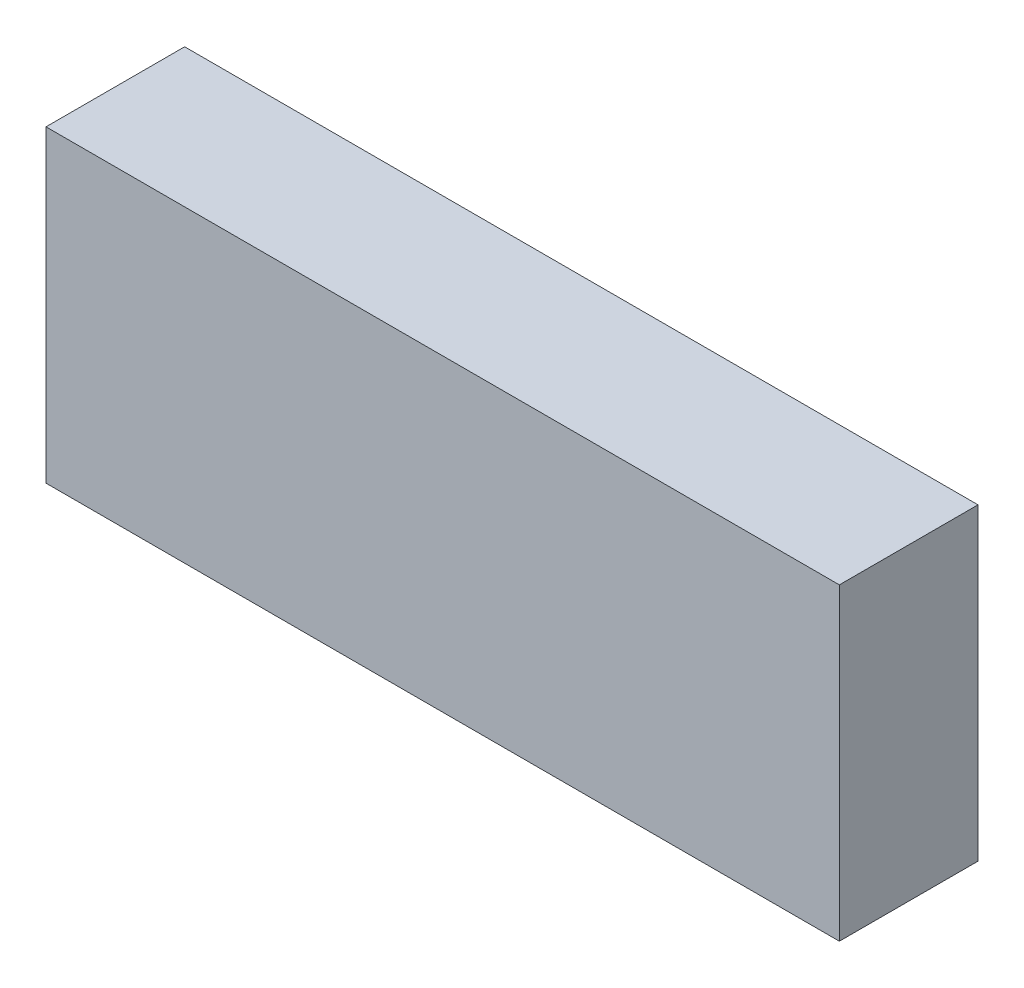
ISO-10303-21;
HEADER;
FILE_DESCRIPTION(('STEP AP214'),'2;1');
FILE_NAME('part.step','',(''),(''),'','','');
FILE_SCHEMA(('AUTOMOTIVE_DESIGN { 1 0 10303 214 1 1 1 1 }'));
ENDSEC;
DATA;
#1=APPLICATION_CONTEXT('core data for automotive mechanical design processes');
#2=APPLICATION_PROTOCOL_DEFINITION('international standard','automotive_design',2000,#1);
#3=PRODUCT_CONTEXT('',#1,'mechanical');
#4=PRODUCT('Part','Part','',(#3));
#5=PRODUCT_RELATED_PRODUCT_CATEGORY('part','',(#4));
#6=PRODUCT_DEFINITION_FORMATION('','',#4);
#7=PRODUCT_DEFINITION_CONTEXT('part definition',#1,'design');
#8=PRODUCT_DEFINITION('design','',#6,#7);
#9=PRODUCT_DEFINITION_SHAPE('','',#8);
#10=(LENGTH_UNIT() NAMED_UNIT(*) SI_UNIT(.MILLI.,.METRE.));
#11=(NAMED_UNIT(*) PLANE_ANGLE_UNIT() SI_UNIT($,.RADIAN.));
#12=(NAMED_UNIT(*) SI_UNIT($,.STERADIAN.) SOLID_ANGLE_UNIT());
#13=UNCERTAINTY_MEASURE_WITH_UNIT(LENGTH_MEASURE(1.E-05),#10,'distance_accuracy_value','');
#14=(GEOMETRIC_REPRESENTATION_CONTEXT(3) GLOBAL_UNCERTAINTY_ASSIGNED_CONTEXT((#13)) GLOBAL_UNIT_ASSIGNED_CONTEXT((#10,
#11,#12)) REPRESENTATION_CONTEXT('',''));
#15=CARTESIAN_POINT('',(0.,0.,0.));
#16=DIRECTION('',(0.,0.,1.));
#17=DIRECTION('',(1.,0.,0.));
#18=AXIS2_PLACEMENT_3D('',#15,#16,#17);
#19=CARTESIAN_POINT('',(0.,0.,12.7));
#20=DIRECTION('',(1.,0.,0.));
#21=DIRECTION('',(0.,0.,-1.));
#22=AXIS2_PLACEMENT_3D('',#19,#20,#21);
#23=PLANE('',#22);
#24=DIRECTION('',(0.,-1.,0.));
#25=VECTOR('',#24,1.);
#26=CARTESIAN_POINT('',(0.,0.,0.));
#27=LINE('',#26,#25);
#28=CARTESIAN_POINT('',(0.,28.2711959947381,0.));
#29=VERTEX_POINT('',#28);
#30=CARTESIAN_POINT('',(0.,0.,0.));
#31=VERTEX_POINT('',#30);
#32=EDGE_CURVE('E98',#29,#31,#27,.T.);
#33=ORIENTED_EDGE('',*,*,#32,.T.);
#34=DIRECTION('',(0.,0.,-1.));
#35=VECTOR('',#34,1.);
#36=CARTESIAN_POINT('',(0.,0.,12.7));
#37=LINE('',#36,#35);
#38=CARTESIAN_POINT('',(0.,0.,12.7));
#39=VERTEX_POINT('',#38);
#40=EDGE_CURVE('E11',#39,#31,#37,.T.);
#41=ORIENTED_EDGE('',*,*,#40,.F.);
#42=DIRECTION('',(0.,-1.,0.));
#43=VECTOR('',#42,1.);
#44=CARTESIAN_POINT('',(0.,0.,12.7));
#45=LINE('',#44,#43);
#46=CARTESIAN_POINT('',(0.,28.2711959947381,12.7));
#47=VERTEX_POINT('',#46);
#48=EDGE_CURVE('E86',#47,#39,#45,.T.);
#49=ORIENTED_EDGE('',*,*,#48,.F.);
#50=DIRECTION('',(0.,0.,-1.));
#51=VECTOR('',#50,1.);
#52=CARTESIAN_POINT('',(0.,28.2711959947381,12.7));
#53=LINE('',#52,#51);
#54=EDGE_CURVE('E94',#47,#29,#53,.T.);
#55=ORIENTED_EDGE('',*,*,#54,.T.);
#56=EDGE_LOOP('',(#33,#41,#49,#55));
#57=FACE_BOUND('',#56,.T.);
#58=ADVANCED_FACE('F35',(#57),#23,.F.);
#59=CARTESIAN_POINT('',(0.,0.,12.7));
#60=DIRECTION('',(0.,1.,0.));
#61=DIRECTION('',(0.,0.,1.));
#62=AXIS2_PLACEMENT_3D('',#59,#60,#61);
#63=PLANE('',#62);
#64=DIRECTION('',(1.,0.,0.));
#65=VECTOR('',#64,1.);
#66=CARTESIAN_POINT('',(0.,0.,0.));
#67=LINE('',#66,#65);
#68=CARTESIAN_POINT('',(72.6740830758109,0.,0.));
#69=VERTEX_POINT('',#68);
#70=EDGE_CURVE('E90',#31,#69,#67,.T.);
#71=ORIENTED_EDGE('',*,*,#70,.T.);
#72=DIRECTION('',(0.,0.,-1.));
#73=VECTOR('',#72,1.);
#74=CARTESIAN_POINT('',(72.6740830758109,0.,12.7));
#75=LINE('',#74,#73);
#76=CARTESIAN_POINT('',(72.6740830758109,0.,12.7));
#77=VERTEX_POINT('',#76);
#78=EDGE_CURVE('E43',#77,#69,#75,.T.);
#79=ORIENTED_EDGE('',*,*,#78,.F.);
#80=DIRECTION('',(1.,0.,0.));
#81=VECTOR('',#80,1.);
#82=CARTESIAN_POINT('',(0.,0.,12.7));
#83=LINE('',#82,#81);
#84=EDGE_CURVE('E81',#39,#77,#83,.T.);
#85=ORIENTED_EDGE('',*,*,#84,.F.);
#86=ORIENTED_EDGE('',*,*,#40,.T.);
#87=EDGE_LOOP('',(#71,#79,#85,#86));
#88=FACE_BOUND('',#87,.T.);
#89=ADVANCED_FACE('F89',(#88),#63,.F.);
#90=CARTESIAN_POINT('',(72.6740830758109,0.,12.7));
#91=DIRECTION('',(-1.,0.,0.));
#92=DIRECTION('',(0.,0.,1.));
#93=AXIS2_PLACEMENT_3D('',#90,#91,#92);
#94=PLANE('',#93);
#95=DIRECTION('',(0.,1.,0.));
#96=VECTOR('',#95,1.);
#97=CARTESIAN_POINT('',(72.6740830758109,0.,0.));
#98=LINE('',#97,#96);
#99=CARTESIAN_POINT('',(72.6740830758109,28.2711959947381,0.));
#100=VERTEX_POINT('',#99);
#101=EDGE_CURVE('E68',#69,#100,#98,.T.);
#102=ORIENTED_EDGE('',*,*,#101,.T.);
#103=DIRECTION('',(0.,0.,-1.));
#104=VECTOR('',#103,1.);
#105=CARTESIAN_POINT('',(72.6740830758109,28.2711959947381,12.7));
#106=LINE('',#105,#104);
#107=CARTESIAN_POINT('',(72.6740830758109,28.2711959947381,12.7));
#108=VERTEX_POINT('',#107);
#109=EDGE_CURVE('E91',#108,#100,#106,.T.);
#110=ORIENTED_EDGE('',*,*,#109,.F.);
#111=DIRECTION('',(0.,1.,0.));
#112=VECTOR('',#111,1.);
#113=CARTESIAN_POINT('',(72.6740830758109,0.,12.7));
#114=LINE('',#113,#112);
#115=EDGE_CURVE('E84',#77,#108,#114,.T.);
#116=ORIENTED_EDGE('',*,*,#115,.F.);
#117=ORIENTED_EDGE('',*,*,#78,.T.);
#118=EDGE_LOOP('',(#102,#110,#116,#117));
#119=FACE_BOUND('',#118,.T.);
#120=ADVANCED_FACE('F92',(#119),#94,.F.);
#121=CARTESIAN_POINT('',(0.,28.2711959947381,12.7));
#122=DIRECTION('',(0.,-1.,0.));
#123=DIRECTION('',(0.,0.,-1.));
#124=AXIS2_PLACEMENT_3D('',#121,#122,#123);
#125=PLANE('',#124);
#126=DIRECTION('',(-1.,0.,0.));
#127=VECTOR('',#126,1.);
#128=CARTESIAN_POINT('',(0.,28.2711959947381,0.));
#129=LINE('',#128,#127);
#130=EDGE_CURVE('E74',#100,#29,#129,.T.);
#131=ORIENTED_EDGE('',*,*,#130,.T.);
#132=ORIENTED_EDGE('',*,*,#54,.F.);
#133=DIRECTION('',(-1.,0.,0.));
#134=VECTOR('',#133,1.);
#135=CARTESIAN_POINT('',(0.,28.2711959947381,12.7));
#136=LINE('',#135,#134);
#137=EDGE_CURVE('E51',#108,#47,#136,.T.);
#138=ORIENTED_EDGE('',*,*,#137,.F.);
#139=ORIENTED_EDGE('',*,*,#109,.T.);
#140=EDGE_LOOP('',(#131,#132,#138,#139));
#141=FACE_BOUND('',#140,.T.);
#142=ADVANCED_FACE('F105',(#141),#125,.F.);
#143=CARTESIAN_POINT('',(0.,0.,12.7));
#144=DIRECTION('',(0.,0.,-1.));
#145=DIRECTION('',(-1.,0.,0.));
#146=AXIS2_PLACEMENT_3D('',#143,#144,#145);
#147=PLANE('',#146);
#148=ORIENTED_EDGE('',*,*,#48,.T.);
#149=ORIENTED_EDGE('',*,*,#84,.T.);
#150=ORIENTED_EDGE('',*,*,#115,.T.);
#151=ORIENTED_EDGE('',*,*,#137,.T.);
#152=EDGE_LOOP('',(#148,#149,#150,#151));
#153=FACE_BOUND('',#152,.T.);
#154=ADVANCED_FACE('F82',(#153),#147,.F.);
#155=CARTESIAN_POINT('',(0.,0.,0.));
#156=DIRECTION('',(0.,0.,-1.));
#157=DIRECTION('',(-1.,0.,0.));
#158=AXIS2_PLACEMENT_3D('',#155,#156,#157);
#159=PLANE('',#158);
#160=ORIENTED_EDGE('',*,*,#32,.F.);
#161=ORIENTED_EDGE('',*,*,#130,.F.);
#162=ORIENTED_EDGE('',*,*,#101,.F.);
#163=ORIENTED_EDGE('',*,*,#70,.F.);
#164=EDGE_LOOP('',(#160,#161,#162,#163));
#165=FACE_BOUND('',#164,.T.);
#166=ADVANCED_FACE('F108',(#165),#159,.T.);
#167=CLOSED_SHELL('',(#58,#89,#120,#142,#154,#166));
#168=MANIFOLD_SOLID_BREP('B2',#167);
#169=ADVANCED_BREP_SHAPE_REPRESENTATION('',(#18,#168),#14);
#170=SHAPE_DEFINITION_REPRESENTATION(#9,#169);
ENDSEC;
END-ISO-10303-21;
